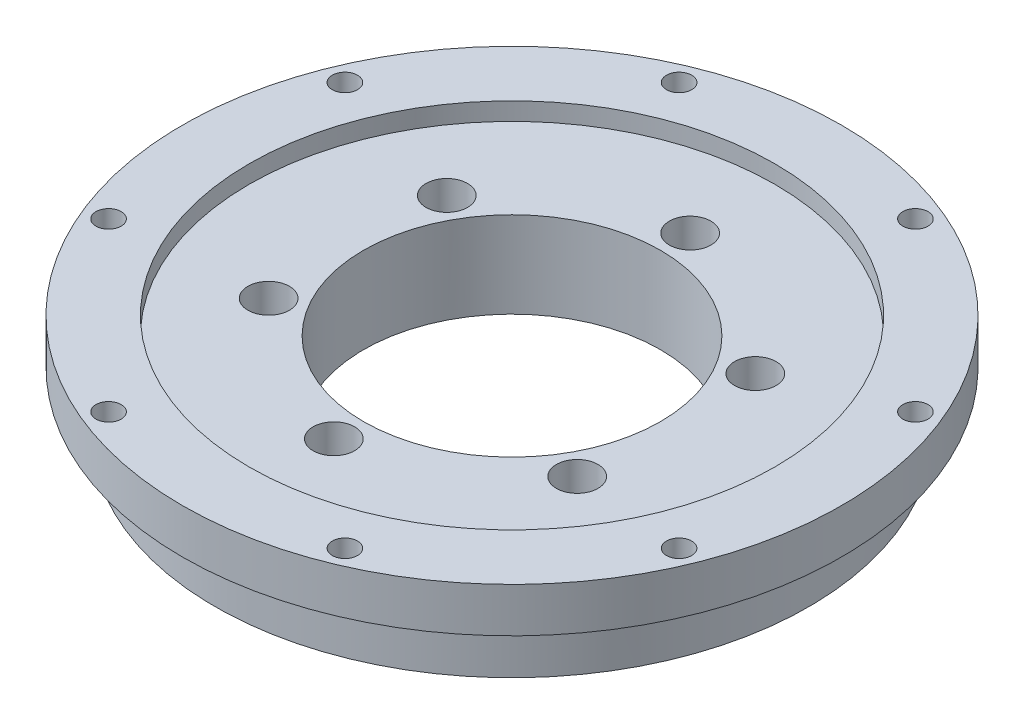
ISO-10303-21;
HEADER;
FILE_DESCRIPTION(('STEP AP214'),'2;1');
FILE_NAME('part.step','',(''),(''),'','','');
FILE_SCHEMA(('AUTOMOTIVE_DESIGN { 1 0 10303 214 1 1 1 1 }'));
ENDSEC;
DATA;
#1=APPLICATION_CONTEXT('core data for automotive mechanical design processes');
#2=APPLICATION_PROTOCOL_DEFINITION('international standard','automotive_design',2000,#1);
#3=PRODUCT_CONTEXT('',#1,'mechanical');
#4=PRODUCT('Part','Part','',(#3));
#5=PRODUCT_RELATED_PRODUCT_CATEGORY('part','',(#4));
#6=PRODUCT_DEFINITION_FORMATION('','',#4);
#7=PRODUCT_DEFINITION_CONTEXT('part definition',#1,'design');
#8=PRODUCT_DEFINITION('design','',#6,#7);
#9=PRODUCT_DEFINITION_SHAPE('','',#8);
#10=(LENGTH_UNIT() NAMED_UNIT(*) SI_UNIT(.MILLI.,.METRE.));
#11=(NAMED_UNIT(*) PLANE_ANGLE_UNIT() SI_UNIT($,.RADIAN.));
#12=(NAMED_UNIT(*) SI_UNIT($,.STERADIAN.) SOLID_ANGLE_UNIT());
#13=UNCERTAINTY_MEASURE_WITH_UNIT(LENGTH_MEASURE(1.E-05),#10,'distance_accuracy_value','');
#14=(GEOMETRIC_REPRESENTATION_CONTEXT(3) GLOBAL_UNCERTAINTY_ASSIGNED_CONTEXT((#13)) GLOBAL_UNIT_ASSIGNED_CONTEXT((#10,
#11,#12)) REPRESENTATION_CONTEXT('',''));
#15=CARTESIAN_POINT('',(0.,0.,0.));
#16=DIRECTION('',(0.,0.,1.));
#17=DIRECTION('',(1.,0.,0.));
#18=AXIS2_PLACEMENT_3D('',#15,#16,#17);
#19=CARTESIAN_POINT('',(51.9615242270663,35.001,30.));
#20=DIRECTION('',(0.,-1.,0.));
#21=DIRECTION('',(0.,0.,-1.));
#22=AXIS2_PLACEMENT_3D('',#19,#20,#21);
#23=CYLINDRICAL_SURFACE('',#22,5.);
#24=CARTESIAN_POINT('',(51.9615242270663,0.,30.));
#25=DIRECTION('',(0.,-1.,0.));
#26=DIRECTION('',(0.,0.,-1.));
#27=AXIS2_PLACEMENT_3D('',#24,#25,#26);
#28=CIRCLE('',#27,5.);
#29=CARTESIAN_POINT('',(51.9615242270663,0.,25.));
#30=VERTEX_POINT('',#29);
#31=EDGE_CURVE('E281',#30,#30,#28,.T.);
#32=ORIENTED_EDGE('',*,*,#31,.T.);
#33=EDGE_LOOP('',(#32));
#34=FACE_BOUND('',#33,.T.);
#35=CARTESIAN_POINT('',(51.9615242270663,19.,30.));
#36=DIRECTION('',(0.,1.,0.));
#37=DIRECTION('',(0.,0.,1.));
#38=AXIS2_PLACEMENT_3D('',#35,#36,#37);
#39=CIRCLE('',#38,5.);
#40=CARTESIAN_POINT('',(51.9615242270663,19.,35.));
#41=VERTEX_POINT('',#40);
#42=EDGE_CURVE('E159',#41,#41,#39,.F.);
#43=ORIENTED_EDGE('',*,*,#42,.F.);
#44=EDGE_LOOP('',(#43));
#45=FACE_BOUND('',#44,.T.);
#46=ADVANCED_FACE('F40',(#34,#45),#23,.F.);
#47=CARTESIAN_POINT('',(51.9615242270663,35.001,-30.));
#48=DIRECTION('',(0.,-1.,0.));
#49=DIRECTION('',(0.,0.,-1.));
#50=AXIS2_PLACEMENT_3D('',#47,#48,#49);
#51=CYLINDRICAL_SURFACE('',#50,5.);
#52=CARTESIAN_POINT('',(51.9615242270663,0.,-30.));
#53=DIRECTION('',(0.,-1.,0.));
#54=DIRECTION('',(0.,0.,-1.));
#55=AXIS2_PLACEMENT_3D('',#52,#53,#54);
#56=CIRCLE('',#55,5.);
#57=CARTESIAN_POINT('',(51.9615242270663,0.,-35.));
#58=VERTEX_POINT('',#57);
#59=EDGE_CURVE('E287',#58,#58,#56,.T.);
#60=ORIENTED_EDGE('',*,*,#59,.T.);
#61=EDGE_LOOP('',(#60));
#62=FACE_BOUND('',#61,.T.);
#63=CARTESIAN_POINT('',(51.9615242270663,19.,-30.));
#64=DIRECTION('',(0.,1.,0.));
#65=DIRECTION('',(0.,0.,1.));
#66=AXIS2_PLACEMENT_3D('',#63,#64,#65);
#67=CIRCLE('',#66,5.);
#68=CARTESIAN_POINT('',(51.9615242270663,19.,-25.));
#69=VERTEX_POINT('',#68);
#70=EDGE_CURVE('E156',#69,#69,#67,.F.);
#71=ORIENTED_EDGE('',*,*,#70,.F.);
#72=EDGE_LOOP('',(#71));
#73=FACE_BOUND('',#72,.T.);
#74=ADVANCED_FACE('F351',(#62,#73),#51,.F.);
#75=CARTESIAN_POINT('',(0.,35.001,-60.));
#76=DIRECTION('',(0.,-1.,0.));
#77=DIRECTION('',(0.,0.,-1.));
#78=AXIS2_PLACEMENT_3D('',#75,#76,#77);
#79=CYLINDRICAL_SURFACE('',#78,5.);
#80=CARTESIAN_POINT('',(0.,0.,-60.));
#81=DIRECTION('',(0.,-1.,0.));
#82=DIRECTION('',(0.,0.,-1.));
#83=AXIS2_PLACEMENT_3D('',#80,#81,#82);
#84=CIRCLE('',#83,5.);
#85=CARTESIAN_POINT('',(0.,0.,-65.));
#86=VERTEX_POINT('',#85);
#87=EDGE_CURVE('E290',#86,#86,#84,.T.);
#88=ORIENTED_EDGE('',*,*,#87,.T.);
#89=EDGE_LOOP('',(#88));
#90=FACE_BOUND('',#89,.T.);
#91=CARTESIAN_POINT('',(0.,19.,-60.));
#92=DIRECTION('',(0.,1.,0.));
#93=DIRECTION('',(0.,0.,1.));
#94=AXIS2_PLACEMENT_3D('',#91,#92,#93);
#95=CIRCLE('',#94,5.);
#96=CARTESIAN_POINT('',(0.,19.,-55.));
#97=VERTEX_POINT('',#96);
#98=EDGE_CURVE('E153',#97,#97,#95,.F.);
#99=ORIENTED_EDGE('',*,*,#98,.F.);
#100=EDGE_LOOP('',(#99));
#101=FACE_BOUND('',#100,.T.);
#102=ADVANCED_FACE('F357',(#90,#101),#79,.F.);
#103=CARTESIAN_POINT('',(-51.9615242270663,35.001,-30.));
#104=DIRECTION('',(0.,-1.,0.));
#105=DIRECTION('',(0.,0.,-1.));
#106=AXIS2_PLACEMENT_3D('',#103,#104,#105);
#107=CYLINDRICAL_SURFACE('',#106,5.);
#108=CARTESIAN_POINT('',(-51.9615242270663,0.,-30.));
#109=DIRECTION('',(0.,-1.,0.));
#110=DIRECTION('',(0.,0.,-1.));
#111=AXIS2_PLACEMENT_3D('',#108,#109,#110);
#112=CIRCLE('',#111,5.);
#113=CARTESIAN_POINT('',(-51.9615242270663,0.,-35.));
#114=VERTEX_POINT('',#113);
#115=EDGE_CURVE('E284',#114,#114,#112,.T.);
#116=ORIENTED_EDGE('',*,*,#115,.T.);
#117=EDGE_LOOP('',(#116));
#118=FACE_BOUND('',#117,.T.);
#119=CARTESIAN_POINT('',(-51.9615242270663,19.,-30.));
#120=DIRECTION('',(0.,1.,0.));
#121=DIRECTION('',(0.,0.,1.));
#122=AXIS2_PLACEMENT_3D('',#119,#120,#121);
#123=CIRCLE('',#122,5.);
#124=CARTESIAN_POINT('',(-51.9615242270663,19.,-25.));
#125=VERTEX_POINT('',#124);
#126=EDGE_CURVE('E150',#125,#125,#123,.F.);
#127=ORIENTED_EDGE('',*,*,#126,.F.);
#128=EDGE_LOOP('',(#127));
#129=FACE_BOUND('',#128,.T.);
#130=ADVANCED_FACE('F295',(#118,#129),#107,.F.);
#131=CARTESIAN_POINT('',(-51.9615242270663,35.001,30.));
#132=DIRECTION('',(0.,-1.,0.));
#133=DIRECTION('',(0.,0.,-1.));
#134=AXIS2_PLACEMENT_3D('',#131,#132,#133);
#135=CYLINDRICAL_SURFACE('',#134,5.00000000000001);
#136=CARTESIAN_POINT('',(-51.9615242270663,0.,30.));
#137=DIRECTION('',(0.,-1.,0.));
#138=DIRECTION('',(0.,0.,-1.));
#139=AXIS2_PLACEMENT_3D('',#136,#137,#138);
#140=CIRCLE('',#139,5.00000000000001);
#141=CARTESIAN_POINT('',(-51.9615242270663,0.,25.));
#142=VERTEX_POINT('',#141);
#143=EDGE_CURVE('E277',#142,#142,#140,.T.);
#144=ORIENTED_EDGE('',*,*,#143,.T.);
#145=EDGE_LOOP('',(#144));
#146=FACE_BOUND('',#145,.T.);
#147=CARTESIAN_POINT('',(-51.9615242270663,19.,30.));
#148=DIRECTION('',(0.,1.,0.));
#149=DIRECTION('',(0.,0.,1.));
#150=AXIS2_PLACEMENT_3D('',#147,#148,#149);
#151=CIRCLE('',#150,5.00000000000001);
#152=CARTESIAN_POINT('',(-51.9615242270663,19.,35.));
#153=VERTEX_POINT('',#152);
#154=EDGE_CURVE('E146',#153,#153,#151,.F.);
#155=ORIENTED_EDGE('',*,*,#154,.F.);
#156=EDGE_LOOP('',(#155));
#157=FACE_BOUND('',#156,.T.);
#158=ADVANCED_FACE('F362',(#146,#157),#135,.F.);
#159=CARTESIAN_POINT('',(0.,35.001,60.));
#160=DIRECTION('',(0.,-1.,0.));
#161=DIRECTION('',(0.,0.,-1.));
#162=AXIS2_PLACEMENT_3D('',#159,#160,#161);
#163=CYLINDRICAL_SURFACE('',#162,5.);
#164=CARTESIAN_POINT('',(0.,0.,60.));
#165=DIRECTION('',(0.,-1.,0.));
#166=DIRECTION('',(0.,0.,-1.));
#167=AXIS2_PLACEMENT_3D('',#164,#165,#166);
#168=CIRCLE('',#167,5.);
#169=CARTESIAN_POINT('',(0.,0.,55.));
#170=VERTEX_POINT('',#169);
#171=EDGE_CURVE('E278',#170,#170,#168,.T.);
#172=ORIENTED_EDGE('',*,*,#171,.T.);
#173=EDGE_LOOP('',(#172));
#174=FACE_BOUND('',#173,.T.);
#175=CARTESIAN_POINT('',(0.,19.,60.));
#176=DIRECTION('',(0.,1.,0.));
#177=DIRECTION('',(0.,0.,1.));
#178=AXIS2_PLACEMENT_3D('',#175,#176,#177);
#179=CIRCLE('',#178,5.);
#180=CARTESIAN_POINT('',(0.,19.,65.));
#181=VERTEX_POINT('',#180);
#182=EDGE_CURVE('E143',#181,#181,#179,.F.);
#183=ORIENTED_EDGE('',*,*,#182,.F.);
#184=EDGE_LOOP('',(#183));
#185=FACE_BOUND('',#184,.T.);
#186=ADVANCED_FACE('F316',(#174,#185),#163,.F.);
#187=CARTESIAN_POINT('',(0.,0.,0.));
#188=DIRECTION('',(0.,-1.,0.));
#189=DIRECTION('',(0.,0.,-1.));
#190=AXIS2_PLACEMENT_3D('',#187,#188,#189);
#191=CYLINDRICAL_SURFACE('',#190,50.);
#192=CARTESIAN_POINT('',(0.,0.,0.));
#193=DIRECTION('',(0.,-1.,0.));
#194=DIRECTION('',(0.,0.,-1.));
#195=AXIS2_PLACEMENT_3D('',#192,#193,#194);
#196=CIRCLE('',#195,50.);
#197=CARTESIAN_POINT('',(0.,0.,-50.));
#198=VERTEX_POINT('',#197);
#199=EDGE_CURVE('E12',#198,#198,#196,.T.);
#200=ORIENTED_EDGE('',*,*,#199,.T.);
#201=EDGE_LOOP('',(#200));
#202=FACE_BOUND('',#201,.T.);
#203=CARTESIAN_POINT('',(0.,29.,0.));
#204=DIRECTION('',(0.,1.,0.));
#205=DIRECTION('',(0.,0.,1.));
#206=AXIS2_PLACEMENT_3D('',#203,#204,#205);
#207=CIRCLE('',#206,50.);
#208=CARTESIAN_POINT('',(0.,29.,50.));
#209=VERTEX_POINT('',#208);
#210=EDGE_CURVE('E272',#209,#209,#207,.T.);
#211=ORIENTED_EDGE('',*,*,#210,.T.);
#212=EDGE_LOOP('',(#211));
#213=FACE_BOUND('',#212,.T.);
#214=ADVANCED_FACE('F301',(#202,#213),#191,.F.);
#215=CARTESIAN_POINT('',(100.,0.,0.));
#216=DIRECTION('',(0.,-1.,0.));
#217=DIRECTION('',(0.,0.,-1.));
#218=AXIS2_PLACEMENT_3D('',#215,#216,#217);
#219=PLANE('',#218);
#220=ORIENTED_EDGE('',*,*,#171,.F.);
#221=EDGE_LOOP('',(#220));
#222=FACE_BOUND('',#221,.T.);
#223=ORIENTED_EDGE('',*,*,#143,.F.);
#224=EDGE_LOOP('',(#223));
#225=FACE_BOUND('',#224,.T.);
#226=ORIENTED_EDGE('',*,*,#115,.F.);
#227=EDGE_LOOP('',(#226));
#228=FACE_BOUND('',#227,.T.);
#229=ORIENTED_EDGE('',*,*,#87,.F.);
#230=EDGE_LOOP('',(#229));
#231=FACE_BOUND('',#230,.T.);
#232=ORIENTED_EDGE('',*,*,#59,.F.);
#233=EDGE_LOOP('',(#232));
#234=FACE_BOUND('',#233,.T.);
#235=ORIENTED_EDGE('',*,*,#31,.F.);
#236=EDGE_LOOP('',(#235));
#237=FACE_BOUND('',#236,.T.);
#238=CARTESIAN_POINT('',(0.,0.,0.));
#239=DIRECTION('',(0.,-1.,0.));
#240=DIRECTION('',(0.,0.,-1.));
#241=AXIS2_PLACEMENT_3D('',#238,#239,#240);
#242=CIRCLE('',#241,100.);
#243=CARTESIAN_POINT('',(0.,0.,-100.));
#244=VERTEX_POINT('',#243);
#245=EDGE_CURVE('E137',#244,#244,#242,.T.);
#246=ORIENTED_EDGE('',*,*,#245,.T.);
#247=EDGE_LOOP('',(#246));
#248=FACE_BOUND('',#247,.T.);
#249=ORIENTED_EDGE('',*,*,#199,.F.);
#250=EDGE_LOOP('',(#249));
#251=FACE_BOUND('',#250,.T.);
#252=ADVANCED_FACE('F42',(#222,#225,#228,#231,#234,#237,#248,#251),#219,.T.);
#253=CARTESIAN_POINT('',(50.,35.,0.));
#254=DIRECTION('',(0.,1.,0.));
#255=DIRECTION('',(0.,0.,1.));
#256=AXIS2_PLACEMENT_3D('',#253,#254,#255);
#257=PLANE('',#256);
#258=CARTESIAN_POINT('',(96.0834713811734,35.,39.7990769659704));
#259=DIRECTION('',(0.,1.,0.));
#260=DIRECTION('',(0.,0.,1.));
#261=AXIS2_PLACEMENT_3D('',#258,#259,#260);
#262=CIRCLE('',#261,4.25);
#263=CARTESIAN_POINT('',(96.0834713811734,35.,44.0490769659704));
#264=VERTEX_POINT('',#263);
#265=EDGE_CURVE('E44',#264,#264,#262,.T.);
#266=ORIENTED_EDGE('',*,*,#265,.F.);
#267=EDGE_LOOP('',(#266));
#268=FACE_BOUND('',#267,.T.);
#269=CARTESIAN_POINT('',(96.0834713811742,35.,-39.7990769659684));
#270=DIRECTION('',(0.,1.,0.));
#271=DIRECTION('',(0.,0.,1.));
#272=AXIS2_PLACEMENT_3D('',#269,#270,#271);
#273=CIRCLE('',#272,4.25);
#274=CARTESIAN_POINT('',(96.0834713811742,35.,-35.5490769659684));
#275=VERTEX_POINT('',#274);
#276=EDGE_CURVE('E192',#275,#275,#273,.T.);
#277=ORIENTED_EDGE('',*,*,#276,.F.);
#278=EDGE_LOOP('',(#277));
#279=FACE_BOUND('',#278,.T.);
#280=CARTESIAN_POINT('',(39.7990769659701,35.,-96.0834713811735));
#281=DIRECTION('',(0.,1.,0.));
#282=DIRECTION('',(0.,0.,1.));
#283=AXIS2_PLACEMENT_3D('',#280,#281,#282);
#284=CIRCLE('',#283,4.24999999999999);
#285=CARTESIAN_POINT('',(39.7990769659701,35.,-91.8334713811735));
#286=VERTEX_POINT('',#285);
#287=EDGE_CURVE('E188',#286,#286,#284,.T.);
#288=ORIENTED_EDGE('',*,*,#287,.F.);
#289=EDGE_LOOP('',(#288));
#290=FACE_BOUND('',#289,.T.);
#291=CARTESIAN_POINT('',(-39.7990769659694,35.,-96.0834713811738));
#292=DIRECTION('',(0.,1.,0.));
#293=DIRECTION('',(0.,0.,1.));
#294=AXIS2_PLACEMENT_3D('',#291,#292,#293);
#295=CIRCLE('',#294,4.24999999999999);
#296=CARTESIAN_POINT('',(-39.7990769659694,35.,-91.8334713811738));
#297=VERTEX_POINT('',#296);
#298=EDGE_CURVE('E183',#297,#297,#295,.T.);
#299=ORIENTED_EDGE('',*,*,#298,.F.);
#300=EDGE_LOOP('',(#299));
#301=FACE_BOUND('',#300,.T.);
#302=CARTESIAN_POINT('',(-96.0834713811737,35.,-39.7990769659698));
#303=DIRECTION('',(0.,1.,0.));
#304=DIRECTION('',(0.,0.,1.));
#305=AXIS2_PLACEMENT_3D('',#302,#303,#304);
#306=CIRCLE('',#305,4.25);
#307=CARTESIAN_POINT('',(-96.0834713811737,35.,-35.5490769659698));
#308=VERTEX_POINT('',#307);
#309=EDGE_CURVE('E178',#308,#308,#306,.T.);
#310=ORIENTED_EDGE('',*,*,#309,.F.);
#311=EDGE_LOOP('',(#310));
#312=FACE_BOUND('',#311,.T.);
#313=CARTESIAN_POINT('',(-96.0834713811739,35.,39.7990769659691));
#314=DIRECTION('',(0.,1.,0.));
#315=DIRECTION('',(0.,0.,1.));
#316=AXIS2_PLACEMENT_3D('',#313,#314,#315);
#317=CIRCLE('',#316,4.25);
#318=CARTESIAN_POINT('',(-96.0834713811739,35.,44.0490769659691));
#319=VERTEX_POINT('',#318);
#320=EDGE_CURVE('E173',#319,#319,#317,.T.);
#321=ORIENTED_EDGE('',*,*,#320,.F.);
#322=EDGE_LOOP('',(#321));
#323=FACE_BOUND('',#322,.T.);
#324=CARTESIAN_POINT('',(-39.7990769659694,35.,96.0834713811738));
#325=DIRECTION('',(0.,1.,0.));
#326=DIRECTION('',(0.,0.,1.));
#327=AXIS2_PLACEMENT_3D('',#324,#325,#326);
#328=CIRCLE('',#327,4.24999999999999);
#329=CARTESIAN_POINT('',(-39.7990769659694,35.,100.333471381174));
#330=VERTEX_POINT('',#329);
#331=EDGE_CURVE('E168',#330,#330,#328,.T.);
#332=ORIENTED_EDGE('',*,*,#331,.F.);
#333=EDGE_LOOP('',(#332));
#334=FACE_BOUND('',#333,.T.);
#335=CARTESIAN_POINT('',(39.7990769659694,35.,96.0834713811738));
#336=DIRECTION('',(0.,1.,0.));
#337=DIRECTION('',(0.,0.,1.));
#338=AXIS2_PLACEMENT_3D('',#335,#336,#337);
#339=CIRCLE('',#338,4.24999999999999);
#340=CARTESIAN_POINT('',(39.7990769659694,35.,100.333471381174));
#341=VERTEX_POINT('',#340);
#342=EDGE_CURVE('E163',#341,#341,#339,.T.);
#343=ORIENTED_EDGE('',*,*,#342,.F.);
#344=EDGE_LOOP('',(#343));
#345=FACE_BOUND('',#344,.T.);
#346=CARTESIAN_POINT('',(0.,35.,0.));
#347=DIRECTION('',(0.,1.,0.));
#348=DIRECTION('',(0.,0.,1.));
#349=AXIS2_PLACEMENT_3D('',#346,#347,#348);
#350=CIRCLE('',#349,88.5);
#351=CARTESIAN_POINT('',(0.,35.,88.5));
#352=VERTEX_POINT('',#351);
#353=EDGE_CURVE('E162',#352,#352,#350,.T.);
#354=ORIENTED_EDGE('',*,*,#353,.F.);
#355=EDGE_LOOP('',(#354));
#356=FACE_BOUND('',#355,.T.);
#357=CARTESIAN_POINT('',(0.,35.,0.));
#358=DIRECTION('',(0.,-1.,0.));
#359=DIRECTION('',(0.,0.,-1.));
#360=AXIS2_PLACEMENT_3D('',#357,#358,#359);
#361=CIRCLE('',#360,111.);
#362=CARTESIAN_POINT('',(0.,35.,-111.));
#363=VERTEX_POINT('',#362);
#364=EDGE_CURVE('E49',#363,#363,#361,.T.);
#365=ORIENTED_EDGE('',*,*,#364,.F.);
#366=EDGE_LOOP('',(#365));
#367=FACE_BOUND('',#366,.T.);
#368=ADVANCED_FACE('F300',(#268,#279,#290,#301,#312,#323,#334,#345,#356,#367),#257,.T.);
#369=CARTESIAN_POINT('',(0.,0.,0.));
#370=DIRECTION('',(0.,-1.,0.));
#371=DIRECTION('',(0.,0.,-1.));
#372=AXIS2_PLACEMENT_3D('',#369,#370,#371);
#373=CYLINDRICAL_SURFACE('',#372,111.);
#374=ORIENTED_EDGE('',*,*,#364,.T.);
#375=EDGE_LOOP('',(#374));
#376=FACE_BOUND('',#375,.T.);
#377=CARTESIAN_POINT('',(0.,20.,0.));
#378=DIRECTION('',(0.,-1.,0.));
#379=DIRECTION('',(0.,0.,-1.));
#380=AXIS2_PLACEMENT_3D('',#377,#378,#379);
#381=CIRCLE('',#380,111.);
#382=CARTESIAN_POINT('',(0.,20.,-111.));
#383=VERTEX_POINT('',#382);
#384=EDGE_CURVE('E135',#383,#383,#381,.T.);
#385=ORIENTED_EDGE('',*,*,#384,.F.);
#386=EDGE_LOOP('',(#385));
#387=FACE_BOUND('',#386,.T.);
#388=ADVANCED_FACE('F335',(#376,#387),#373,.T.);
#389=CARTESIAN_POINT('',(111.,20.,0.));
#390=DIRECTION('',(0.,-1.,0.));
#391=DIRECTION('',(0.,0.,-1.));
#392=AXIS2_PLACEMENT_3D('',#389,#390,#391);
#393=PLANE('',#392);
#394=CARTESIAN_POINT('',(96.0834713811734,20.,39.7990769659704));
#395=DIRECTION('',(0.,-1.,0.));
#396=DIRECTION('',(0.,0.,-1.));
#397=AXIS2_PLACEMENT_3D('',#394,#395,#396);
#398=CIRCLE('',#397,5.025);
#399=CARTESIAN_POINT('',(93.4880604746607,20.,35.496232880211));
#400=VERTEX_POINT('',#399);
#401=CARTESIAN_POINT('',(91.2056684977838,20.,41.0064145454387));
#402=VERTEX_POINT('',#401);
#403=EDGE_CURVE('E115',#400,#402,#398,.T.);
#404=ORIENTED_EDGE('',*,*,#403,.F.);
#405=CARTESIAN_POINT('',(0.,20.,0.));
#406=DIRECTION('',(0.,-1.,0.));
#407=DIRECTION('',(0.,0.,-1.));
#408=AXIS2_PLACEMENT_3D('',#405,#406,#407);
#409=CIRCLE('',#408,100.);
#410=CARTESIAN_POINT('',(93.4880604746601,20.,-35.4962328802127));
#411=VERTEX_POINT('',#410);
#412=EDGE_CURVE('E109',#411,#400,#409,.T.);
#413=ORIENTED_EDGE('',*,*,#412,.F.);
#414=CARTESIAN_POINT('',(96.0834713811742,20.,-39.7990769659684));
#415=DIRECTION('',(0.,-1.,0.));
#416=DIRECTION('',(0.,0.,-1.));
#417=AXIS2_PLACEMENT_3D('',#414,#415,#416);
#418=CIRCLE('',#417,5.025);
#419=CARTESIAN_POINT('',(91.2056684977846,20.,-41.0064145454367));
#420=VERTEX_POINT('',#419);
#421=EDGE_CURVE('E205',#420,#411,#418,.T.);
#422=ORIENTED_EDGE('',*,*,#421,.F.);
#423=CARTESIAN_POINT('',(41.0064145454384,20.,-91.2056684977839));
#424=VERTEX_POINT('',#423);
#425=EDGE_CURVE('E131',#424,#420,#409,.T.);
#426=ORIENTED_EDGE('',*,*,#425,.F.);
#427=CARTESIAN_POINT('',(39.7990769659701,20.,-96.0834713811735));
#428=DIRECTION('',(0.,-1.,0.));
#429=DIRECTION('',(0.,0.,-1.));
#430=AXIS2_PLACEMENT_3D('',#427,#428,#429);
#431=CIRCLE('',#430,5.025);
#432=CARTESIAN_POINT('',(35.4962328802106,20.,-93.4880604746609));
#433=VERTEX_POINT('',#432);
#434=EDGE_CURVE('E194',#433,#424,#431,.T.);
#435=ORIENTED_EDGE('',*,*,#434,.F.);
#436=CARTESIAN_POINT('',(-35.4962328802099,20.,-93.4880604746612));
#437=VERTEX_POINT('',#436);
#438=EDGE_CURVE('E534',#437,#433,#409,.T.);
#439=ORIENTED_EDGE('',*,*,#438,.F.);
#440=CARTESIAN_POINT('',(-39.7990769659694,20.,-96.0834713811738));
#441=DIRECTION('',(0.,-1.,0.));
#442=DIRECTION('',(0.,0.,-1.));
#443=AXIS2_PLACEMENT_3D('',#440,#441,#442);
#444=CIRCLE('',#443,5.025);
#445=CARTESIAN_POINT('',(-41.0064145454377,20.,-91.2056684977842));
#446=VERTEX_POINT('',#445);
#447=EDGE_CURVE('E190',#446,#437,#444,.T.);
#448=ORIENTED_EDGE('',*,*,#447,.F.);
#449=CARTESIAN_POINT('',(-91.2056684977841,20.,-41.006414545438));
#450=VERTEX_POINT('',#449);
#451=EDGE_CURVE('E538',#450,#446,#409,.T.);
#452=ORIENTED_EDGE('',*,*,#451,.F.);
#453=CARTESIAN_POINT('',(-96.0834713811737,20.,-39.7990769659698));
#454=DIRECTION('',(0.,-1.,0.));
#455=DIRECTION('',(0.,0.,-1.));
#456=AXIS2_PLACEMENT_3D('',#453,#454,#455);
#457=CIRCLE('',#456,5.025);
#458=CARTESIAN_POINT('',(-93.488060474661,20.,-35.4962328802103));
#459=VERTEX_POINT('',#458);
#460=EDGE_CURVE('E186',#459,#450,#457,.T.);
#461=ORIENTED_EDGE('',*,*,#460,.F.);
#462=CARTESIAN_POINT('',(-93.4880604746613,20.,35.4962328802097));
#463=VERTEX_POINT('',#462);
#464=EDGE_CURVE('E543',#463,#459,#409,.T.);
#465=ORIENTED_EDGE('',*,*,#464,.F.);
#466=CARTESIAN_POINT('',(-96.0834713811739,20.,39.7990769659691));
#467=DIRECTION('',(0.,-1.,0.));
#468=DIRECTION('',(0.,0.,-1.));
#469=AXIS2_PLACEMENT_3D('',#466,#467,#468);
#470=CIRCLE('',#469,5.025);
#471=CARTESIAN_POINT('',(-91.2056684977843,20.,41.0064145454374));
#472=VERTEX_POINT('',#471);
#473=EDGE_CURVE('E181',#472,#463,#470,.T.);
#474=ORIENTED_EDGE('',*,*,#473,.F.);
#475=CARTESIAN_POINT('',(-41.0064145454377,20.,91.2056684977842));
#476=VERTEX_POINT('',#475);
#477=EDGE_CURVE('E549',#476,#472,#409,.T.);
#478=ORIENTED_EDGE('',*,*,#477,.F.);
#479=CARTESIAN_POINT('',(-39.7990769659694,20.,96.0834713811738));
#480=DIRECTION('',(0.,-1.,0.));
#481=DIRECTION('',(0.,0.,-1.));
#482=AXIS2_PLACEMENT_3D('',#479,#480,#481);
#483=CIRCLE('',#482,5.025);
#484=CARTESIAN_POINT('',(-35.49623288021,20.,93.4880604746612));
#485=VERTEX_POINT('',#484);
#486=EDGE_CURVE('E226',#485,#476,#483,.T.);
#487=ORIENTED_EDGE('',*,*,#486,.F.);
#488=CARTESIAN_POINT('',(35.4962328802099,20.,93.4880604746612));
#489=VERTEX_POINT('',#488);
#490=EDGE_CURVE('E136',#489,#485,#409,.T.);
#491=ORIENTED_EDGE('',*,*,#490,.F.);
#492=CARTESIAN_POINT('',(39.7990769659694,20.,96.0834713811738));
#493=DIRECTION('',(0.,-1.,0.));
#494=DIRECTION('',(0.,0.,-1.));
#495=AXIS2_PLACEMENT_3D('',#492,#493,#494);
#496=CIRCLE('',#495,5.025);
#497=CARTESIAN_POINT('',(41.0064145454377,20.,91.2056684977842));
#498=VERTEX_POINT('',#497);
#499=EDGE_CURVE('E231',#498,#489,#496,.T.);
#500=ORIENTED_EDGE('',*,*,#499,.F.);
#501=EDGE_CURVE('E110',#402,#498,#409,.T.);
#502=ORIENTED_EDGE('',*,*,#501,.F.);
#503=EDGE_LOOP('',(#404,#413,#422,#426,#435,#439,#448,#452,#461,#465,#474,#478,#487,#491,#500,#502));
#504=FACE_BOUND('',#503,.T.);
#505=ORIENTED_EDGE('',*,*,#384,.T.);
#506=EDGE_LOOP('',(#505));
#507=FACE_BOUND('',#506,.T.);
#508=ADVANCED_FACE('F121',(#504,#507),#393,.T.);
#509=CARTESIAN_POINT('',(0.,0.,0.));
#510=DIRECTION('',(0.,-1.,0.));
#511=DIRECTION('',(0.,0.,-1.));
#512=AXIS2_PLACEMENT_3D('',#509,#510,#511);
#513=CYLINDRICAL_SURFACE('',#512,100.);
#514=EDGE_CURVE('E132',#498,#489,#409,.T.);
#515=ORIENTED_EDGE('',*,*,#514,.T.);
#516=ORIENTED_EDGE('',*,*,#490,.T.);
#517=EDGE_CURVE('E551',#485,#476,#409,.T.);
#518=ORIENTED_EDGE('',*,*,#517,.T.);
#519=ORIENTED_EDGE('',*,*,#477,.T.);
#520=EDGE_CURVE('E546',#472,#463,#409,.T.);
#521=ORIENTED_EDGE('',*,*,#520,.T.);
#522=ORIENTED_EDGE('',*,*,#464,.T.);
#523=EDGE_CURVE('E540',#459,#450,#409,.T.);
#524=ORIENTED_EDGE('',*,*,#523,.T.);
#525=ORIENTED_EDGE('',*,*,#451,.T.);
#526=EDGE_CURVE('E535',#446,#437,#409,.T.);
#527=ORIENTED_EDGE('',*,*,#526,.T.);
#528=ORIENTED_EDGE('',*,*,#438,.T.);
#529=EDGE_CURVE('E533',#433,#424,#409,.T.);
#530=ORIENTED_EDGE('',*,*,#529,.T.);
#531=ORIENTED_EDGE('',*,*,#425,.T.);
#532=EDGE_CURVE('E130',#420,#411,#409,.T.);
#533=ORIENTED_EDGE('',*,*,#532,.T.);
#534=ORIENTED_EDGE('',*,*,#412,.T.);
#535=EDGE_CURVE('E105',#400,#402,#409,.T.);
#536=ORIENTED_EDGE('',*,*,#535,.T.);
#537=ORIENTED_EDGE('',*,*,#501,.T.);
#538=EDGE_LOOP('',(#515,#516,#518,#519,#521,#522,#524,#525,#527,#528,#530,#531,#533,#534,#536,#537));
#539=FACE_BOUND('',#538,.T.);
#540=ORIENTED_EDGE('',*,*,#245,.F.);
#541=EDGE_LOOP('',(#540));
#542=FACE_BOUND('',#541,.T.);
#543=ADVANCED_FACE('F127',(#539,#542),#513,.T.);
#544=CARTESIAN_POINT('',(0.,29.,0.));
#545=DIRECTION('',(0.,1.,0.));
#546=DIRECTION('',(0.,0.,1.));
#547=AXIS2_PLACEMENT_3D('',#544,#545,#546);
#548=PLANE('',#547);
#549=CARTESIAN_POINT('',(0.,29.,-60.));
#550=DIRECTION('',(0.,1.,0.));
#551=DIRECTION('',(0.,0.,1.));
#552=AXIS2_PLACEMENT_3D('',#549,#550,#551);
#553=CIRCLE('',#552,7.);
#554=CARTESIAN_POINT('',(0.,29.,-53.));
#555=VERTEX_POINT('',#554);
#556=EDGE_CURVE('E237',#555,#555,#553,.T.);
#557=ORIENTED_EDGE('',*,*,#556,.F.);
#558=EDGE_LOOP('',(#557));
#559=FACE_BOUND('',#558,.T.);
#560=CARTESIAN_POINT('',(-51.9615242270663,29.,-30.));
#561=DIRECTION('',(0.,1.,0.));
#562=DIRECTION('',(0.,0.,1.));
#563=AXIS2_PLACEMENT_3D('',#560,#561,#562);
#564=CIRCLE('',#563,6.99999999999999);
#565=CARTESIAN_POINT('',(-51.9615242270663,29.,-23.));
#566=VERTEX_POINT('',#565);
#567=EDGE_CURVE('E166',#566,#566,#564,.T.);
#568=ORIENTED_EDGE('',*,*,#567,.F.);
#569=EDGE_LOOP('',(#568));
#570=FACE_BOUND('',#569,.T.);
#571=CARTESIAN_POINT('',(-51.9615242270663,29.,30.));
#572=DIRECTION('',(0.,1.,0.));
#573=DIRECTION('',(0.,0.,1.));
#574=AXIS2_PLACEMENT_3D('',#571,#572,#573);
#575=CIRCLE('',#574,7.);
#576=CARTESIAN_POINT('',(-51.9615242270663,29.,37.));
#577=VERTEX_POINT('',#576);
#578=EDGE_CURVE('E244',#577,#577,#575,.T.);
#579=ORIENTED_EDGE('',*,*,#578,.F.);
#580=EDGE_LOOP('',(#579));
#581=FACE_BOUND('',#580,.T.);
#582=CARTESIAN_POINT('',(0.,29.,60.));
#583=DIRECTION('',(0.,1.,0.));
#584=DIRECTION('',(0.,0.,1.));
#585=AXIS2_PLACEMENT_3D('',#582,#583,#584);
#586=CIRCLE('',#585,7.);
#587=CARTESIAN_POINT('',(0.,29.,67.));
#588=VERTEX_POINT('',#587);
#589=EDGE_CURVE('E261',#588,#588,#586,.T.);
#590=ORIENTED_EDGE('',*,*,#589,.F.);
#591=EDGE_LOOP('',(#590));
#592=FACE_BOUND('',#591,.T.);
#593=CARTESIAN_POINT('',(51.9615242270663,29.,30.));
#594=DIRECTION('',(0.,1.,0.));
#595=DIRECTION('',(0.,0.,1.));
#596=AXIS2_PLACEMENT_3D('',#593,#594,#595);
#597=CIRCLE('',#596,6.99999999999999);
#598=CARTESIAN_POINT('',(51.9615242270663,29.,37.));
#599=VERTEX_POINT('',#598);
#600=EDGE_CURVE('E255',#599,#599,#597,.T.);
#601=ORIENTED_EDGE('',*,*,#600,.F.);
#602=EDGE_LOOP('',(#601));
#603=FACE_BOUND('',#602,.T.);
#604=CARTESIAN_POINT('',(51.9615242270663,29.,-30.));
#605=DIRECTION('',(0.,1.,0.));
#606=DIRECTION('',(0.,0.,1.));
#607=AXIS2_PLACEMENT_3D('',#604,#605,#606);
#608=CIRCLE('',#607,7.);
#609=CARTESIAN_POINT('',(51.9615242270663,29.,-23.));
#610=VERTEX_POINT('',#609);
#611=EDGE_CURVE('E249',#610,#610,#608,.T.);
#612=ORIENTED_EDGE('',*,*,#611,.F.);
#613=EDGE_LOOP('',(#612));
#614=FACE_BOUND('',#613,.T.);
#615=ORIENTED_EDGE('',*,*,#210,.F.);
#616=EDGE_LOOP('',(#615));
#617=FACE_BOUND('',#616,.T.);
#618=CARTESIAN_POINT('',(0.,29.,0.));
#619=DIRECTION('',(0.,1.,0.));
#620=DIRECTION('',(0.,0.,1.));
#621=AXIS2_PLACEMENT_3D('',#618,#619,#620);
#622=CIRCLE('',#621,88.5);
#623=CARTESIAN_POINT('',(0.,29.,88.5));
#624=VERTEX_POINT('',#623);
#625=EDGE_CURVE('E269',#624,#624,#622,.T.);
#626=ORIENTED_EDGE('',*,*,#625,.T.);
#627=EDGE_LOOP('',(#626));
#628=FACE_BOUND('',#627,.T.);
#629=ADVANCED_FACE('F319',(#559,#570,#581,#592,#603,#614,#617,#628),#548,.T.);
#630=CARTESIAN_POINT('',(0.,29.,0.));
#631=DIRECTION('',(0.,1.,0.));
#632=DIRECTION('',(0.,0.,1.));
#633=AXIS2_PLACEMENT_3D('',#630,#631,#632);
#634=CYLINDRICAL_SURFACE('',#633,88.5);
#635=ORIENTED_EDGE('',*,*,#625,.F.);
#636=EDGE_LOOP('',(#635));
#637=FACE_BOUND('',#636,.T.);
#638=ORIENTED_EDGE('',*,*,#353,.T.);
#639=EDGE_LOOP('',(#638));
#640=FACE_BOUND('',#639,.T.);
#641=ADVANCED_FACE('F322',(#637,#640),#634,.F.);
#642=CARTESIAN_POINT('',(51.9615242270663,19.,-30.));
#643=DIRECTION('',(0.,1.,0.));
#644=DIRECTION('',(0.,0.,1.));
#645=AXIS2_PLACEMENT_3D('',#642,#643,#644);
#646=PLANE('',#645);
#647=CARTESIAN_POINT('',(51.9615242270663,19.,-30.));
#648=DIRECTION('',(0.,1.,0.));
#649=DIRECTION('',(0.,0.,1.));
#650=AXIS2_PLACEMENT_3D('',#647,#648,#649);
#651=CIRCLE('',#650,7.);
#652=CARTESIAN_POINT('',(51.9615242270663,19.,-23.));
#653=VERTEX_POINT('',#652);
#654=EDGE_CURVE('E240',#653,#653,#651,.T.);
#655=ORIENTED_EDGE('',*,*,#654,.T.);
#656=EDGE_LOOP('',(#655));
#657=FACE_BOUND('',#656,.T.);
#658=ORIENTED_EDGE('',*,*,#70,.T.);
#659=EDGE_LOOP('',(#658));
#660=FACE_BOUND('',#659,.T.);
#661=ADVANCED_FACE('F329',(#657,#660),#646,.T.);
#662=CARTESIAN_POINT('',(51.9615242270663,19.,-30.));
#663=DIRECTION('',(0.,1.,0.));
#664=DIRECTION('',(0.,0.,1.));
#665=AXIS2_PLACEMENT_3D('',#662,#663,#664);
#666=CYLINDRICAL_SURFACE('',#665,7.);
#667=ORIENTED_EDGE('',*,*,#654,.F.);
#668=EDGE_LOOP('',(#667));
#669=FACE_BOUND('',#668,.T.);
#670=ORIENTED_EDGE('',*,*,#611,.T.);
#671=EDGE_LOOP('',(#670));
#672=FACE_BOUND('',#671,.T.);
#673=ADVANCED_FACE('F408',(#669,#672),#666,.F.);
#674=CARTESIAN_POINT('',(51.9615242270663,19.,30.));
#675=DIRECTION('',(0.,1.,0.));
#676=DIRECTION('',(0.,0.,1.));
#677=AXIS2_PLACEMENT_3D('',#674,#675,#676);
#678=PLANE('',#677);
#679=CARTESIAN_POINT('',(51.9615242270663,19.,30.));
#680=DIRECTION('',(0.,1.,0.));
#681=DIRECTION('',(0.,0.,1.));
#682=AXIS2_PLACEMENT_3D('',#679,#680,#681);
#683=CIRCLE('',#682,6.99999999999999);
#684=CARTESIAN_POINT('',(51.9615242270663,19.,37.));
#685=VERTEX_POINT('',#684);
#686=EDGE_CURVE('E252',#685,#685,#683,.T.);
#687=ORIENTED_EDGE('',*,*,#686,.T.);
#688=EDGE_LOOP('',(#687));
#689=FACE_BOUND('',#688,.T.);
#690=ORIENTED_EDGE('',*,*,#42,.T.);
#691=EDGE_LOOP('',(#690));
#692=FACE_BOUND('',#691,.T.);
#693=ADVANCED_FACE('F404',(#689,#692),#678,.T.);
#694=CARTESIAN_POINT('',(51.9615242270663,19.,30.));
#695=DIRECTION('',(0.,1.,0.));
#696=DIRECTION('',(0.,0.,1.));
#697=AXIS2_PLACEMENT_3D('',#694,#695,#696);
#698=CYLINDRICAL_SURFACE('',#697,6.99999999999999);
#699=ORIENTED_EDGE('',*,*,#686,.F.);
#700=EDGE_LOOP('',(#699));
#701=FACE_BOUND('',#700,.T.);
#702=ORIENTED_EDGE('',*,*,#600,.T.);
#703=EDGE_LOOP('',(#702));
#704=FACE_BOUND('',#703,.T.);
#705=ADVANCED_FACE('F400',(#701,#704),#698,.F.);
#706=CARTESIAN_POINT('',(0.,19.,60.));
#707=DIRECTION('',(0.,1.,0.));
#708=DIRECTION('',(0.,0.,1.));
#709=AXIS2_PLACEMENT_3D('',#706,#707,#708);
#710=PLANE('',#709);
#711=CARTESIAN_POINT('',(0.,19.,60.));
#712=DIRECTION('',(0.,1.,0.));
#713=DIRECTION('',(0.,0.,1.));
#714=AXIS2_PLACEMENT_3D('',#711,#712,#713);
#715=CIRCLE('',#714,7.);
#716=CARTESIAN_POINT('',(0.,19.,67.));
#717=VERTEX_POINT('',#716);
#718=EDGE_CURVE('E258',#717,#717,#715,.T.);
#719=ORIENTED_EDGE('',*,*,#718,.T.);
#720=EDGE_LOOP('',(#719));
#721=FACE_BOUND('',#720,.T.);
#722=ORIENTED_EDGE('',*,*,#182,.T.);
#723=EDGE_LOOP('',(#722));
#724=FACE_BOUND('',#723,.T.);
#725=ADVANCED_FACE('F394',(#721,#724),#710,.T.);
#726=CARTESIAN_POINT('',(0.,19.,60.));
#727=DIRECTION('',(0.,1.,0.));
#728=DIRECTION('',(0.,0.,1.));
#729=AXIS2_PLACEMENT_3D('',#726,#727,#728);
#730=CYLINDRICAL_SURFACE('',#729,7.);
#731=ORIENTED_EDGE('',*,*,#718,.F.);
#732=EDGE_LOOP('',(#731));
#733=FACE_BOUND('',#732,.T.);
#734=ORIENTED_EDGE('',*,*,#589,.T.);
#735=EDGE_LOOP('',(#734));
#736=FACE_BOUND('',#735,.T.);
#737=ADVANCED_FACE('F384',(#733,#736),#730,.F.);
#738=CARTESIAN_POINT('',(-51.9615242270663,19.,30.));
#739=DIRECTION('',(0.,1.,0.));
#740=DIRECTION('',(0.,0.,1.));
#741=AXIS2_PLACEMENT_3D('',#738,#739,#740);
#742=PLANE('',#741);
#743=CARTESIAN_POINT('',(-51.9615242270663,19.,30.));
#744=DIRECTION('',(0.,1.,0.));
#745=DIRECTION('',(0.,0.,1.));
#746=AXIS2_PLACEMENT_3D('',#743,#744,#745);
#747=CIRCLE('',#746,7.);
#748=CARTESIAN_POINT('',(-51.9615242270663,19.,37.));
#749=VERTEX_POINT('',#748);
#750=EDGE_CURVE('E264',#749,#749,#747,.T.);
#751=ORIENTED_EDGE('',*,*,#750,.T.);
#752=EDGE_LOOP('',(#751));
#753=FACE_BOUND('',#752,.T.);
#754=ORIENTED_EDGE('',*,*,#154,.T.);
#755=EDGE_LOOP('',(#754));
#756=FACE_BOUND('',#755,.T.);
#757=ADVANCED_FACE('F381',(#753,#756),#742,.T.);
#758=CARTESIAN_POINT('',(-51.9615242270663,19.,30.));
#759=DIRECTION('',(0.,1.,0.));
#760=DIRECTION('',(0.,0.,1.));
#761=AXIS2_PLACEMENT_3D('',#758,#759,#760);
#762=CYLINDRICAL_SURFACE('',#761,7.);
#763=ORIENTED_EDGE('',*,*,#750,.F.);
#764=EDGE_LOOP('',(#763));
#765=FACE_BOUND('',#764,.T.);
#766=ORIENTED_EDGE('',*,*,#578,.T.);
#767=EDGE_LOOP('',(#766));
#768=FACE_BOUND('',#767,.T.);
#769=ADVANCED_FACE('F383',(#765,#768),#762,.F.);
#770=CARTESIAN_POINT('',(-51.9615242270663,19.,-30.));
#771=DIRECTION('',(0.,1.,0.));
#772=DIRECTION('',(0.,0.,1.));
#773=AXIS2_PLACEMENT_3D('',#770,#771,#772);
#774=PLANE('',#773);
#775=CARTESIAN_POINT('',(-51.9615242270663,19.,-30.));
#776=DIRECTION('',(0.,1.,0.));
#777=DIRECTION('',(0.,0.,1.));
#778=AXIS2_PLACEMENT_3D('',#775,#776,#777);
#779=CIRCLE('',#778,6.99999999999999);
#780=CARTESIAN_POINT('',(-51.9615242270663,19.,-23.));
#781=VERTEX_POINT('',#780);
#782=EDGE_CURVE('E241',#781,#781,#779,.T.);
#783=ORIENTED_EDGE('',*,*,#782,.T.);
#784=EDGE_LOOP('',(#783));
#785=FACE_BOUND('',#784,.T.);
#786=ORIENTED_EDGE('',*,*,#126,.T.);
#787=EDGE_LOOP('',(#786));
#788=FACE_BOUND('',#787,.T.);
#789=ADVANCED_FACE('F391',(#785,#788),#774,.T.);
#790=CARTESIAN_POINT('',(-51.9615242270663,19.,-30.));
#791=DIRECTION('',(0.,1.,0.));
#792=DIRECTION('',(0.,0.,1.));
#793=AXIS2_PLACEMENT_3D('',#790,#791,#792);
#794=CYLINDRICAL_SURFACE('',#793,6.99999999999999);
#795=ORIENTED_EDGE('',*,*,#782,.F.);
#796=EDGE_LOOP('',(#795));
#797=FACE_BOUND('',#796,.T.);
#798=ORIENTED_EDGE('',*,*,#567,.T.);
#799=EDGE_LOOP('',(#798));
#800=FACE_BOUND('',#799,.T.);
#801=ADVANCED_FACE('F416',(#797,#800),#794,.F.);
#802=CARTESIAN_POINT('',(0.,19.,-60.));
#803=DIRECTION('',(0.,1.,0.));
#804=DIRECTION('',(0.,0.,1.));
#805=AXIS2_PLACEMENT_3D('',#802,#803,#804);
#806=PLANE('',#805);
#807=CARTESIAN_POINT('',(0.,19.,-60.));
#808=DIRECTION('',(0.,1.,0.));
#809=DIRECTION('',(0.,0.,1.));
#810=AXIS2_PLACEMENT_3D('',#807,#808,#809);
#811=CIRCLE('',#810,7.);
#812=CARTESIAN_POINT('',(0.,19.,-53.));
#813=VERTEX_POINT('',#812);
#814=EDGE_CURVE('E147',#813,#813,#811,.T.);
#815=ORIENTED_EDGE('',*,*,#814,.T.);
#816=EDGE_LOOP('',(#815));
#817=FACE_BOUND('',#816,.T.);
#818=ORIENTED_EDGE('',*,*,#98,.T.);
#819=EDGE_LOOP('',(#818));
#820=FACE_BOUND('',#819,.T.);
#821=ADVANCED_FACE('F419',(#817,#820),#806,.T.);
#822=CARTESIAN_POINT('',(0.,19.,-60.));
#823=DIRECTION('',(0.,1.,0.));
#824=DIRECTION('',(0.,0.,1.));
#825=AXIS2_PLACEMENT_3D('',#822,#823,#824);
#826=CYLINDRICAL_SURFACE('',#825,7.);
#827=ORIENTED_EDGE('',*,*,#814,.F.);
#828=EDGE_LOOP('',(#827));
#829=FACE_BOUND('',#828,.T.);
#830=ORIENTED_EDGE('',*,*,#556,.T.);
#831=EDGE_LOOP('',(#830));
#832=FACE_BOUND('',#831,.T.);
#833=ADVANCED_FACE('F424',(#829,#832),#826,.F.);
#834=CARTESIAN_POINT('',(44.8240769659694,20.,96.0834713811738));
#835=DIRECTION('',(0.,-1.,0.));
#836=DIRECTION('',(0.,0.,-1.));
#837=AXIS2_PLACEMENT_3D('',#834,#835,#836);
#838=PLANE('',#837);
#839=ORIENTED_EDGE('',*,*,#514,.F.);
#840=EDGE_CURVE('E171',#489,#498,#496,.T.);
#841=ORIENTED_EDGE('',*,*,#840,.F.);
#842=EDGE_LOOP('',(#839,#841));
#843=FACE_BOUND('',#842,.T.);
#844=ADVANCED_FACE('F427',(#843),#838,.F.);
#845=CARTESIAN_POINT('',(39.7990769659694,20.,96.0834713811738));
#846=DIRECTION('',(0.,-1.,0.));
#847=DIRECTION('',(0.,0.,-1.));
#848=AXIS2_PLACEMENT_3D('',#845,#846,#847);
#849=CYLINDRICAL_SURFACE('',#848,4.24999999999999);
#850=ORIENTED_EDGE('',*,*,#342,.T.);
#851=EDGE_LOOP('',(#850));
#852=FACE_BOUND('',#851,.T.);
#853=CARTESIAN_POINT('',(39.7990769659694,20.775,96.0834713811738));
#854=DIRECTION('',(0.,-1.,0.));
#855=DIRECTION('',(0.,0.,-1.));
#856=AXIS2_PLACEMENT_3D('',#853,#854,#855);
#857=CIRCLE('',#856,4.25);
#858=CARTESIAN_POINT('',(39.7990769659694,20.775,91.8334713811738));
#859=VERTEX_POINT('',#858);
#860=EDGE_CURVE('E167',#859,#859,#857,.T.);
#861=ORIENTED_EDGE('',*,*,#860,.T.);
#862=EDGE_LOOP('',(#861));
#863=FACE_BOUND('',#862,.T.);
#864=ADVANCED_FACE('F434',(#852,#863),#849,.F.);
#865=CARTESIAN_POINT('',(39.7990769659694,20.,96.0834713811738));
#866=DIRECTION('',(0.,-1.,0.));
#867=DIRECTION('',(0.,0.,-1.));
#868=AXIS2_PLACEMENT_3D('',#865,#866,#867);
#869=CONICAL_SURFACE('',#868,5.025,0.785398163397448);
#870=ORIENTED_EDGE('',*,*,#860,.F.);
#871=EDGE_LOOP('',(#870));
#872=FACE_BOUND('',#871,.T.);
#873=ORIENTED_EDGE('',*,*,#499,.T.);
#874=ORIENTED_EDGE('',*,*,#840,.T.);
#875=EDGE_LOOP('',(#873,#874));
#876=FACE_BOUND('',#875,.T.);
#877=ADVANCED_FACE('F438',(#872,#876),#869,.F.);
#878=CARTESIAN_POINT('',(-34.7740769659694,20.,96.0834713811738));
#879=DIRECTION('',(0.,-1.,0.));
#880=DIRECTION('',(0.,0.,-1.));
#881=AXIS2_PLACEMENT_3D('',#878,#879,#880);
#882=PLANE('',#881);
#883=ORIENTED_EDGE('',*,*,#517,.F.);
#884=EDGE_CURVE('E176',#476,#485,#483,.T.);
#885=ORIENTED_EDGE('',*,*,#884,.F.);
#886=EDGE_LOOP('',(#883,#885));
#887=FACE_BOUND('',#886,.T.);
#888=ADVANCED_FACE('F442',(#887),#882,.F.);
#889=CARTESIAN_POINT('',(-39.7990769659694,20.,96.0834713811738));
#890=DIRECTION('',(0.,-1.,0.));
#891=DIRECTION('',(0.,0.,-1.));
#892=AXIS2_PLACEMENT_3D('',#889,#890,#891);
#893=CYLINDRICAL_SURFACE('',#892,4.24999999999999);
#894=ORIENTED_EDGE('',*,*,#331,.T.);
#895=EDGE_LOOP('',(#894));
#896=FACE_BOUND('',#895,.T.);
#897=CARTESIAN_POINT('',(-39.7990769659694,20.775,96.0834713811738));
#898=DIRECTION('',(0.,-1.,0.));
#899=DIRECTION('',(0.,0.,-1.));
#900=AXIS2_PLACEMENT_3D('',#897,#898,#899);
#901=CIRCLE('',#900,4.25);
#902=CARTESIAN_POINT('',(-39.7990769659694,20.775,91.8334713811738));
#903=VERTEX_POINT('',#902);
#904=EDGE_CURVE('E172',#903,#903,#901,.T.);
#905=ORIENTED_EDGE('',*,*,#904,.T.);
#906=EDGE_LOOP('',(#905));
#907=FACE_BOUND('',#906,.T.);
#908=ADVANCED_FACE('F446',(#896,#907),#893,.F.);
#909=CARTESIAN_POINT('',(-39.7990769659694,20.,96.0834713811738));
#910=DIRECTION('',(0.,-1.,0.));
#911=DIRECTION('',(0.,0.,-1.));
#912=AXIS2_PLACEMENT_3D('',#909,#910,#911);
#913=CONICAL_SURFACE('',#912,5.025,0.785398163397448);
#914=ORIENTED_EDGE('',*,*,#904,.F.);
#915=EDGE_LOOP('',(#914));
#916=FACE_BOUND('',#915,.T.);
#917=ORIENTED_EDGE('',*,*,#486,.T.);
#918=ORIENTED_EDGE('',*,*,#884,.T.);
#919=EDGE_LOOP('',(#917,#918));
#920=FACE_BOUND('',#919,.T.);
#921=ADVANCED_FACE('F450',(#916,#920),#913,.F.);
#922=CARTESIAN_POINT('',(-91.0584713811739,20.,39.7990769659691));
#923=DIRECTION('',(0.,-1.,0.));
#924=DIRECTION('',(0.,0.,-1.));
#925=AXIS2_PLACEMENT_3D('',#922,#923,#924);
#926=PLANE('',#925);
#927=ORIENTED_EDGE('',*,*,#520,.F.);
#928=EDGE_CURVE('E221',#463,#472,#470,.T.);
#929=ORIENTED_EDGE('',*,*,#928,.F.);
#930=EDGE_LOOP('',(#927,#929));
#931=FACE_BOUND('',#930,.T.);
#932=ADVANCED_FACE('F454',(#931),#926,.F.);
#933=CARTESIAN_POINT('',(-96.0834713811739,20.,39.7990769659691));
#934=DIRECTION('',(0.,-1.,0.));
#935=DIRECTION('',(0.,0.,-1.));
#936=AXIS2_PLACEMENT_3D('',#933,#934,#935);
#937=CYLINDRICAL_SURFACE('',#936,4.25);
#938=ORIENTED_EDGE('',*,*,#320,.T.);
#939=EDGE_LOOP('',(#938));
#940=FACE_BOUND('',#939,.T.);
#941=CARTESIAN_POINT('',(-96.0834713811739,20.775,39.7990769659691));
#942=DIRECTION('',(0.,-1.,0.));
#943=DIRECTION('',(0.,0.,-1.));
#944=AXIS2_PLACEMENT_3D('',#941,#942,#943);
#945=CIRCLE('',#944,4.25);
#946=CARTESIAN_POINT('',(-96.0834713811739,20.775,35.5490769659691));
#947=VERTEX_POINT('',#946);
#948=EDGE_CURVE('E177',#947,#947,#945,.T.);
#949=ORIENTED_EDGE('',*,*,#948,.T.);
#950=EDGE_LOOP('',(#949));
#951=FACE_BOUND('',#950,.T.);
#952=ADVANCED_FACE('F458',(#940,#951),#937,.F.);
#953=CARTESIAN_POINT('',(-96.0834713811739,20.,39.7990769659691));
#954=DIRECTION('',(0.,-1.,0.));
#955=DIRECTION('',(0.,0.,-1.));
#956=AXIS2_PLACEMENT_3D('',#953,#954,#955);
#957=CONICAL_SURFACE('',#956,5.025,0.785398163397444);
#958=ORIENTED_EDGE('',*,*,#948,.F.);
#959=EDGE_LOOP('',(#958));
#960=FACE_BOUND('',#959,.T.);
#961=ORIENTED_EDGE('',*,*,#928,.T.);
#962=ORIENTED_EDGE('',*,*,#473,.T.);
#963=EDGE_LOOP('',(#961,#962));
#964=FACE_BOUND('',#963,.T.);
#965=ADVANCED_FACE('F462',(#960,#964),#957,.F.);
#966=CARTESIAN_POINT('',(-91.0584713811736,20.,-39.7990769659698));
#967=DIRECTION('',(0.,-1.,0.));
#968=DIRECTION('',(0.,0.,-1.));
#969=AXIS2_PLACEMENT_3D('',#966,#967,#968);
#970=PLANE('',#969);
#971=ORIENTED_EDGE('',*,*,#523,.F.);
#972=EDGE_CURVE('E217',#450,#459,#457,.T.);
#973=ORIENTED_EDGE('',*,*,#972,.F.);
#974=EDGE_LOOP('',(#971,#973));
#975=FACE_BOUND('',#974,.T.);
#976=ADVANCED_FACE('F466',(#975),#970,.F.);
#977=CARTESIAN_POINT('',(-96.0834713811737,20.,-39.7990769659698));
#978=DIRECTION('',(0.,-1.,0.));
#979=DIRECTION('',(0.,0.,-1.));
#980=AXIS2_PLACEMENT_3D('',#977,#978,#979);
#981=CYLINDRICAL_SURFACE('',#980,4.25);
#982=ORIENTED_EDGE('',*,*,#309,.T.);
#983=EDGE_LOOP('',(#982));
#984=FACE_BOUND('',#983,.T.);
#985=CARTESIAN_POINT('',(-96.0834713811737,20.775,-39.7990769659698));
#986=DIRECTION('',(0.,-1.,0.));
#987=DIRECTION('',(0.,0.,-1.));
#988=AXIS2_PLACEMENT_3D('',#985,#986,#987);
#989=CIRCLE('',#988,4.25);
#990=CARTESIAN_POINT('',(-96.0834713811737,20.775,-44.0490769659698));
#991=VERTEX_POINT('',#990);
#992=EDGE_CURVE('E182',#991,#991,#989,.T.);
#993=ORIENTED_EDGE('',*,*,#992,.T.);
#994=EDGE_LOOP('',(#993));
#995=FACE_BOUND('',#994,.T.);
#996=ADVANCED_FACE('F470',(#984,#995),#981,.F.);
#997=CARTESIAN_POINT('',(-96.0834713811737,20.,-39.7990769659698));
#998=DIRECTION('',(0.,-1.,0.));
#999=DIRECTION('',(0.,0.,-1.));
#1000=AXIS2_PLACEMENT_3D('',#997,#998,#999);
#1001=CONICAL_SURFACE('',#1000,5.025,0.785398163397444);
#1002=ORIENTED_EDGE('',*,*,#992,.F.);
#1003=EDGE_LOOP('',(#1002));
#1004=FACE_BOUND('',#1003,.T.);
#1005=ORIENTED_EDGE('',*,*,#972,.T.);
#1006=ORIENTED_EDGE('',*,*,#460,.T.);
#1007=EDGE_LOOP('',(#1005,#1006));
#1008=FACE_BOUND('',#1007,.T.);
#1009=ADVANCED_FACE('F474',(#1004,#1008),#1001,.F.);
#1010=CARTESIAN_POINT('',(-34.7740769659694,20.,-96.0834713811738));
#1011=DIRECTION('',(0.,-1.,0.));
#1012=DIRECTION('',(0.,0.,-1.));
#1013=AXIS2_PLACEMENT_3D('',#1010,#1011,#1012);
#1014=PLANE('',#1013);
#1015=ORIENTED_EDGE('',*,*,#526,.F.);
#1016=EDGE_CURVE('E212',#437,#446,#444,.T.);
#1017=ORIENTED_EDGE('',*,*,#1016,.F.);
#1018=EDGE_LOOP('',(#1015,#1017));
#1019=FACE_BOUND('',#1018,.T.);
#1020=ADVANCED_FACE('F478',(#1019),#1014,.F.);
#1021=CARTESIAN_POINT('',(-39.7990769659694,20.,-96.0834713811738));
#1022=DIRECTION('',(0.,-1.,0.));
#1023=DIRECTION('',(0.,0.,-1.));
#1024=AXIS2_PLACEMENT_3D('',#1021,#1022,#1023);
#1025=CYLINDRICAL_SURFACE('',#1024,4.24999999999999);
#1026=ORIENTED_EDGE('',*,*,#298,.T.);
#1027=EDGE_LOOP('',(#1026));
#1028=FACE_BOUND('',#1027,.T.);
#1029=CARTESIAN_POINT('',(-39.7990769659694,20.775,-96.0834713811738));
#1030=DIRECTION('',(0.,-1.,0.));
#1031=DIRECTION('',(0.,0.,-1.));
#1032=AXIS2_PLACEMENT_3D('',#1029,#1030,#1031);
#1033=CIRCLE('',#1032,4.25);
#1034=CARTESIAN_POINT('',(-39.7990769659694,20.775,-100.333471381174));
#1035=VERTEX_POINT('',#1034);
#1036=EDGE_CURVE('E187',#1035,#1035,#1033,.T.);
#1037=ORIENTED_EDGE('',*,*,#1036,.T.);
#1038=EDGE_LOOP('',(#1037));
#1039=FACE_BOUND('',#1038,.T.);
#1040=ADVANCED_FACE('F482',(#1028,#1039),#1025,.F.);
#1041=CARTESIAN_POINT('',(-39.7990769659694,20.,-96.0834713811738));
#1042=DIRECTION('',(0.,-1.,0.));
#1043=DIRECTION('',(0.,0.,-1.));
#1044=AXIS2_PLACEMENT_3D('',#1041,#1042,#1043);
#1045=CONICAL_SURFACE('',#1044,5.025,0.785398163397448);
#1046=ORIENTED_EDGE('',*,*,#1036,.F.);
#1047=EDGE_LOOP('',(#1046));
#1048=FACE_BOUND('',#1047,.T.);
#1049=ORIENTED_EDGE('',*,*,#1016,.T.);
#1050=ORIENTED_EDGE('',*,*,#447,.T.);
#1051=EDGE_LOOP('',(#1049,#1050));
#1052=FACE_BOUND('',#1051,.T.);
#1053=ADVANCED_FACE('F486',(#1048,#1052),#1045,.F.);
#1054=CARTESIAN_POINT('',(44.8240769659701,20.,-96.0834713811735));
#1055=DIRECTION('',(0.,-1.,0.));
#1056=DIRECTION('',(0.,0.,-1.));
#1057=AXIS2_PLACEMENT_3D('',#1054,#1055,#1056);
#1058=PLANE('',#1057);
#1059=ORIENTED_EDGE('',*,*,#529,.F.);
#1060=EDGE_CURVE('E199',#424,#433,#431,.T.);
#1061=ORIENTED_EDGE('',*,*,#1060,.F.);
#1062=EDGE_LOOP('',(#1059,#1061));
#1063=FACE_BOUND('',#1062,.T.);
#1064=ADVANCED_FACE('F490',(#1063),#1058,.F.);
#1065=CARTESIAN_POINT('',(39.7990769659701,20.,-96.0834713811735));
#1066=DIRECTION('',(0.,-1.,0.));
#1067=DIRECTION('',(0.,0.,-1.));
#1068=AXIS2_PLACEMENT_3D('',#1065,#1066,#1067);
#1069=CYLINDRICAL_SURFACE('',#1068,4.24999999999999);
#1070=ORIENTED_EDGE('',*,*,#287,.T.);
#1071=EDGE_LOOP('',(#1070));
#1072=FACE_BOUND('',#1071,.T.);
#1073=CARTESIAN_POINT('',(39.7990769659701,20.775,-96.0834713811735));
#1074=DIRECTION('',(0.,-1.,0.));
#1075=DIRECTION('',(0.,0.,-1.));
#1076=AXIS2_PLACEMENT_3D('',#1073,#1074,#1075);
#1077=CIRCLE('',#1076,4.25);
#1078=CARTESIAN_POINT('',(39.7990769659701,20.775,-100.333471381174));
#1079=VERTEX_POINT('',#1078);
#1080=EDGE_CURVE('E191',#1079,#1079,#1077,.T.);
#1081=ORIENTED_EDGE('',*,*,#1080,.T.);
#1082=EDGE_LOOP('',(#1081));
#1083=FACE_BOUND('',#1082,.T.);
#1084=ADVANCED_FACE('F494',(#1072,#1083),#1069,.F.);
#1085=CARTESIAN_POINT('',(39.7990769659701,20.,-96.0834713811735));
#1086=DIRECTION('',(0.,-1.,0.));
#1087=DIRECTION('',(0.,0.,-1.));
#1088=AXIS2_PLACEMENT_3D('',#1085,#1086,#1087);
#1089=CONICAL_SURFACE('',#1088,5.025,0.785398163397448);
#1090=ORIENTED_EDGE('',*,*,#1080,.F.);
#1091=EDGE_LOOP('',(#1090));
#1092=FACE_BOUND('',#1091,.T.);
#1093=ORIENTED_EDGE('',*,*,#1060,.T.);
#1094=ORIENTED_EDGE('',*,*,#434,.T.);
#1095=EDGE_LOOP('',(#1093,#1094));
#1096=FACE_BOUND('',#1095,.T.);
#1097=ADVANCED_FACE('F498',(#1092,#1096),#1089,.F.);
#1098=CARTESIAN_POINT('',(101.108471381174,20.,-39.7990769659684));
#1099=DIRECTION('',(0.,-1.,0.));
#1100=DIRECTION('',(0.,0.,-1.));
#1101=AXIS2_PLACEMENT_3D('',#1098,#1099,#1100);
#1102=PLANE('',#1101);
#1103=ORIENTED_EDGE('',*,*,#532,.F.);
#1104=EDGE_CURVE('E63',#411,#420,#418,.T.);
#1105=ORIENTED_EDGE('',*,*,#1104,.F.);
#1106=EDGE_LOOP('',(#1103,#1105));
#1107=FACE_BOUND('',#1106,.T.);
#1108=ADVANCED_FACE('F502',(#1107),#1102,.F.);
#1109=CARTESIAN_POINT('',(96.0834713811742,20.,-39.7990769659684));
#1110=DIRECTION('',(0.,-1.,0.));
#1111=DIRECTION('',(0.,0.,-1.));
#1112=AXIS2_PLACEMENT_3D('',#1109,#1110,#1111);
#1113=CYLINDRICAL_SURFACE('',#1112,4.25);
#1114=ORIENTED_EDGE('',*,*,#276,.T.);
#1115=EDGE_LOOP('',(#1114));
#1116=FACE_BOUND('',#1115,.T.);
#1117=CARTESIAN_POINT('',(96.0834713811742,20.775,-39.7990769659684));
#1118=DIRECTION('',(0.,-1.,0.));
#1119=DIRECTION('',(0.,0.,-1.));
#1120=AXIS2_PLACEMENT_3D('',#1117,#1118,#1119);
#1121=CIRCLE('',#1120,4.25);
#1122=CARTESIAN_POINT('',(96.0834713811742,20.775,-44.0490769659684));
#1123=VERTEX_POINT('',#1122);
#1124=EDGE_CURVE('E195',#1123,#1123,#1121,.T.);
#1125=ORIENTED_EDGE('',*,*,#1124,.T.);
#1126=EDGE_LOOP('',(#1125));
#1127=FACE_BOUND('',#1126,.T.);
#1128=ADVANCED_FACE('F506',(#1116,#1127),#1113,.F.);
#1129=CARTESIAN_POINT('',(96.0834713811742,20.,-39.7990769659684));
#1130=DIRECTION('',(0.,-1.,0.));
#1131=DIRECTION('',(0.,0.,-1.));
#1132=AXIS2_PLACEMENT_3D('',#1129,#1130,#1131);
#1133=CONICAL_SURFACE('',#1132,5.025,0.785398163397444);
#1134=ORIENTED_EDGE('',*,*,#1124,.F.);
#1135=EDGE_LOOP('',(#1134));
#1136=FACE_BOUND('',#1135,.T.);
#1137=ORIENTED_EDGE('',*,*,#1104,.T.);
#1138=ORIENTED_EDGE('',*,*,#421,.T.);
#1139=EDGE_LOOP('',(#1137,#1138));
#1140=FACE_BOUND('',#1139,.T.);
#1141=ADVANCED_FACE('F509',(#1136,#1140),#1133,.F.);
#1142=CARTESIAN_POINT('',(101.108471381173,20.,39.7990769659704));
#1143=DIRECTION('',(0.,-1.,0.));
#1144=DIRECTION('',(0.,0.,-1.));
#1145=AXIS2_PLACEMENT_3D('',#1142,#1143,#1144);
#1146=PLANE('',#1145);
#1147=ORIENTED_EDGE('',*,*,#535,.F.);
#1148=EDGE_CURVE('E56',#402,#400,#398,.T.);
#1149=ORIENTED_EDGE('',*,*,#1148,.F.);
#1150=EDGE_LOOP('',(#1147,#1149));
#1151=FACE_BOUND('',#1150,.T.);
#1152=ADVANCED_FACE('F106',(#1151),#1146,.F.);
#1153=CARTESIAN_POINT('',(96.0834713811734,20.,39.7990769659704));
#1154=DIRECTION('',(0.,-1.,0.));
#1155=DIRECTION('',(0.,0.,-1.));
#1156=AXIS2_PLACEMENT_3D('',#1153,#1154,#1155);
#1157=CYLINDRICAL_SURFACE('',#1156,4.25);
#1158=ORIENTED_EDGE('',*,*,#265,.T.);
#1159=EDGE_LOOP('',(#1158));
#1160=FACE_BOUND('',#1159,.T.);
#1161=CARTESIAN_POINT('',(96.0834713811734,20.775,39.7990769659704));
#1162=DIRECTION('',(0.,-1.,0.));
#1163=DIRECTION('',(0.,0.,-1.));
#1164=AXIS2_PLACEMENT_3D('',#1161,#1162,#1163);
#1165=CIRCLE('',#1164,4.25);
#1166=CARTESIAN_POINT('',(96.0834713811734,20.775,35.5490769659704));
#1167=VERTEX_POINT('',#1166);
#1168=EDGE_CURVE('E117',#1167,#1167,#1165,.T.);
#1169=ORIENTED_EDGE('',*,*,#1168,.T.);
#1170=EDGE_LOOP('',(#1169));
#1171=FACE_BOUND('',#1170,.T.);
#1172=ADVANCED_FACE('F515',(#1160,#1171),#1157,.F.);
#1173=CARTESIAN_POINT('',(96.0834713811734,20.,39.7990769659704));
#1174=DIRECTION('',(0.,-1.,0.));
#1175=DIRECTION('',(0.,0.,-1.));
#1176=AXIS2_PLACEMENT_3D('',#1173,#1174,#1175);
#1177=CONICAL_SURFACE('',#1176,5.025,0.785398163397444);
#1178=ORIENTED_EDGE('',*,*,#1168,.F.);
#1179=EDGE_LOOP('',(#1178));
#1180=FACE_BOUND('',#1179,.T.);
#1181=ORIENTED_EDGE('',*,*,#1148,.T.);
#1182=ORIENTED_EDGE('',*,*,#403,.T.);
#1183=EDGE_LOOP('',(#1181,#1182));
#1184=FACE_BOUND('',#1183,.T.);
#1185=ADVANCED_FACE('F114',(#1180,#1184),#1177,.F.);
#1186=CLOSED_SHELL('',(#46,#74,#102,#130,#158,#186,#214,#252,#368,#388,#508,#543,#629,#641,#661,
#673,#693,#705,#725,#737,#757,#769,#789,#801,#821,#833,#844,#864,#877,#888,#908,#921,#932,#952,
#965,#976,#996,#1009,#1020,#1040,#1053,#1064,#1084,#1097,#1108,#1128,#1141,#1152,#1172,#1185));
#1187=MANIFOLD_SOLID_BREP('B2',#1186);
#1188=ADVANCED_BREP_SHAPE_REPRESENTATION('',(#18,#1187),#14);
#1189=SHAPE_DEFINITION_REPRESENTATION(#9,#1188);
ENDSEC;
END-ISO-10303-21;
